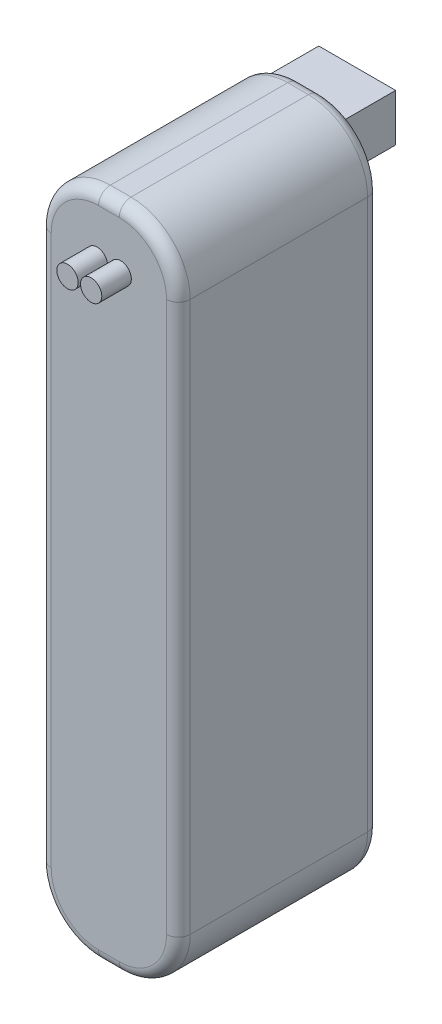
ISO-10303-21;
HEADER;
FILE_DESCRIPTION(('STEP AP214'),'2;1');
FILE_NAME('part.step','',(''),(''),'','','');
FILE_SCHEMA(('AUTOMOTIVE_DESIGN { 1 0 10303 214 1 1 1 1 }'));
ENDSEC;
DATA;
#1=APPLICATION_CONTEXT('core data for automotive mechanical design processes');
#2=APPLICATION_PROTOCOL_DEFINITION('international standard','automotive_design',2000,#1);
#3=PRODUCT_CONTEXT('',#1,'mechanical');
#4=PRODUCT('Part','Part','',(#3));
#5=PRODUCT_RELATED_PRODUCT_CATEGORY('part','',(#4));
#6=PRODUCT_DEFINITION_FORMATION('','',#4);
#7=PRODUCT_DEFINITION_CONTEXT('part definition',#1,'design');
#8=PRODUCT_DEFINITION('design','',#6,#7);
#9=PRODUCT_DEFINITION_SHAPE('','',#8);
#10=(LENGTH_UNIT() NAMED_UNIT(*) SI_UNIT(.MILLI.,.METRE.));
#11=(NAMED_UNIT(*) PLANE_ANGLE_UNIT() SI_UNIT($,.RADIAN.));
#12=(NAMED_UNIT(*) SI_UNIT($,.STERADIAN.) SOLID_ANGLE_UNIT());
#13=UNCERTAINTY_MEASURE_WITH_UNIT(LENGTH_MEASURE(1.E-05),#10,'distance_accuracy_value','');
#14=(GEOMETRIC_REPRESENTATION_CONTEXT(3) GLOBAL_UNCERTAINTY_ASSIGNED_CONTEXT((#13)) GLOBAL_UNIT_ASSIGNED_CONTEXT((#10,
#11,#12)) REPRESENTATION_CONTEXT('',''));
#15=CARTESIAN_POINT('',(0.,0.,0.));
#16=DIRECTION('',(0.,0.,1.));
#17=DIRECTION('',(1.,0.,0.));
#18=AXIS2_PLACEMENT_3D('',#15,#16,#17);
#19=CARTESIAN_POINT('',(-11.75,113.,-17.));
#20=DIRECTION('',(0.,0.,1.));
#21=DIRECTION('',(1.,0.,0.));
#22=AXIS2_PLACEMENT_3D('',#19,#20,#21);
#23=PLANE('',#22);
#24=DIRECTION('',(0.,-1.,0.));
#25=VECTOR('',#24,1.);
#26=CARTESIAN_POINT('',(6.5,103.,-17.));
#27=LINE('',#26,#25);
#28=CARTESIAN_POINT('',(6.5,109.437196594792,-17.));
#29=VERTEX_POINT('',#28);
#30=CARTESIAN_POINT('',(6.5,103.,-17.));
#31=VERTEX_POINT('',#30);
#32=EDGE_CURVE('E442',#29,#31,#27,.T.);
#33=ORIENTED_EDGE('',*,*,#32,.F.);
#34=CARTESIAN_POINT('',(1.75,103.,-17.));
#35=DIRECTION('',(0.,0.,1.));
#36=DIRECTION('',(1.,0.,0.));
#37=AXIS2_PLACEMENT_3D('',#34,#35,#36);
#38=CIRCLE('',#37,8.);
#39=CARTESIAN_POINT('',(9.75,103.,-17.));
#40=VERTEX_POINT('',#39);
#41=EDGE_CURVE('E255',#29,#40,#38,.F.);
#42=ORIENTED_EDGE('',*,*,#41,.T.);
#43=DIRECTION('',(0.,-1.,0.));
#44=VECTOR('',#43,1.);
#45=CARTESIAN_POINT('',(9.75,113.,-17.));
#46=LINE('',#45,#44);
#47=CARTESIAN_POINT('',(9.75,9.99999999999999,-17.));
#48=VERTEX_POINT('',#47);
#49=EDGE_CURVE('E243',#40,#48,#46,.T.);
#50=ORIENTED_EDGE('',*,*,#49,.T.);
#51=CARTESIAN_POINT('',(1.75,9.99999999999999,-17.));
#52=DIRECTION('',(0.,0.,1.));
#53=DIRECTION('',(1.,0.,0.));
#54=AXIS2_PLACEMENT_3D('',#51,#52,#53);
#55=CIRCLE('',#54,8.);
#56=CARTESIAN_POINT('',(1.75,1.99999999999999,-17.));
#57=VERTEX_POINT('',#56);
#58=EDGE_CURVE('E245',#48,#57,#55,.F.);
#59=ORIENTED_EDGE('',*,*,#58,.T.);
#60=DIRECTION('',(-1.,0.,0.));
#61=VECTOR('',#60,1.);
#62=CARTESIAN_POINT('',(-11.75,2.,-17.));
#63=LINE('',#62,#61);
#64=CARTESIAN_POINT('',(-1.75,2.,-17.));
#65=VERTEX_POINT('',#64);
#66=EDGE_CURVE('E247',#57,#65,#63,.T.);
#67=ORIENTED_EDGE('',*,*,#66,.T.);
#68=CARTESIAN_POINT('',(-1.75,9.99999999999999,-17.));
#69=DIRECTION('',(0.,0.,1.));
#70=DIRECTION('',(1.,0.,0.));
#71=AXIS2_PLACEMENT_3D('',#68,#69,#70);
#72=CIRCLE('',#71,8.);
#73=CARTESIAN_POINT('',(-9.75,9.99999999999999,-17.));
#74=VERTEX_POINT('',#73);
#75=EDGE_CURVE('E249',#65,#74,#72,.F.);
#76=ORIENTED_EDGE('',*,*,#75,.T.);
#77=DIRECTION('',(0.,-1.,0.));
#78=VECTOR('',#77,1.);
#79=CARTESIAN_POINT('',(-9.75,113.,-17.));
#80=LINE('',#79,#78);
#81=CARTESIAN_POINT('',(-9.75,103.,-17.));
#82=VERTEX_POINT('',#81);
#83=EDGE_CURVE('E251',#74,#82,#80,.F.);
#84=ORIENTED_EDGE('',*,*,#83,.T.);
#85=CARTESIAN_POINT('',(-1.75,103.,-17.));
#86=DIRECTION('',(0.,0.,1.));
#87=DIRECTION('',(1.,0.,0.));
#88=AXIS2_PLACEMENT_3D('',#85,#86,#87);
#89=CIRCLE('',#88,8.);
#90=CARTESIAN_POINT('',(-6.5,109.437196594792,-17.));
#91=VERTEX_POINT('',#90);
#92=EDGE_CURVE('E253',#82,#91,#89,.F.);
#93=ORIENTED_EDGE('',*,*,#92,.T.);
#94=DIRECTION('',(0.,1.,0.));
#95=VECTOR('',#94,1.);
#96=CARTESIAN_POINT('',(-6.5,103.,-17.));
#97=LINE('',#96,#95);
#98=CARTESIAN_POINT('',(-6.5,103.,-17.));
#99=VERTEX_POINT('',#98);
#100=EDGE_CURVE('E386',#99,#91,#97,.T.);
#101=ORIENTED_EDGE('',*,*,#100,.F.);
#102=DIRECTION('',(-1.,0.,0.));
#103=VECTOR('',#102,1.);
#104=CARTESIAN_POINT('',(6.5,103.,-17.));
#105=LINE('',#104,#103);
#106=EDGE_CURVE('E196',#31,#99,#105,.T.);
#107=ORIENTED_EDGE('',*,*,#106,.F.);
#108=EDGE_LOOP('',(#33,#42,#50,#59,#67,#76,#84,#93,#101,#107));
#109=FACE_BOUND('',#108,.T.);
#110=ADVANCED_FACE('F39',(#109),#23,.F.);
#111=CARTESIAN_POINT('',(11.75,113.,-17.));
#112=DIRECTION('',(-1.,0.,0.));
#113=DIRECTION('',(0.,0.,1.));
#114=AXIS2_PLACEMENT_3D('',#111,#112,#113);
#115=PLANE('',#114);
#116=DIRECTION('',(0.,0.,-1.));
#117=VECTOR('',#116,1.);
#118=CARTESIAN_POINT('',(11.75,9.99999999999999,-17.));
#119=LINE('',#118,#117);
#120=CARTESIAN_POINT('',(11.75,9.99999999999999,15.));
#121=VERTEX_POINT('',#120);
#122=CARTESIAN_POINT('',(11.75,9.99999999999999,-15.));
#123=VERTEX_POINT('',#122);
#124=EDGE_CURVE('E222',#121,#123,#119,.T.);
#125=ORIENTED_EDGE('',*,*,#124,.T.);
#126=DIRECTION('',(0.,-1.,0.));
#127=VECTOR('',#126,1.);
#128=CARTESIAN_POINT('',(11.75,113.,-15.));
#129=LINE('',#128,#127);
#130=CARTESIAN_POINT('',(11.75,103.,-15.));
#131=VERTEX_POINT('',#130);
#132=EDGE_CURVE('E306',#123,#131,#129,.F.);
#133=ORIENTED_EDGE('',*,*,#132,.T.);
#134=DIRECTION('',(0.,0.,-1.));
#135=VECTOR('',#134,1.);
#136=CARTESIAN_POINT('',(11.75,103.,17.));
#137=LINE('',#136,#135);
#138=CARTESIAN_POINT('',(11.75,103.,15.));
#139=VERTEX_POINT('',#138);
#140=EDGE_CURVE('E219',#131,#139,#137,.F.);
#141=ORIENTED_EDGE('',*,*,#140,.T.);
#142=DIRECTION('',(0.,-1.,0.));
#143=VECTOR('',#142,1.);
#144=CARTESIAN_POINT('',(11.75,113.,15.));
#145=LINE('',#144,#143);
#146=EDGE_CURVE('E304',#139,#121,#145,.T.);
#147=ORIENTED_EDGE('',*,*,#146,.T.);
#148=EDGE_LOOP('',(#125,#133,#141,#147));
#149=FACE_BOUND('',#148,.T.);
#150=ADVANCED_FACE('F512',(#149),#115,.F.);
#151=CARTESIAN_POINT('',(-11.75,113.,-17.));
#152=DIRECTION('',(1.,0.,0.));
#153=DIRECTION('',(0.,0.,-1.));
#154=AXIS2_PLACEMENT_3D('',#151,#152,#153);
#155=PLANE('',#154);
#156=DIRECTION('',(0.,0.,1.));
#157=VECTOR('',#156,1.);
#158=CARTESIAN_POINT('',(-11.75,103.,-17.));
#159=LINE('',#158,#157);
#160=CARTESIAN_POINT('',(-11.75,103.,15.));
#161=VERTEX_POINT('',#160);
#162=CARTESIAN_POINT('',(-11.75,103.,-15.));
#163=VERTEX_POINT('',#162);
#164=EDGE_CURVE('E231',#161,#163,#159,.F.);
#165=ORIENTED_EDGE('',*,*,#164,.T.);
#166=DIRECTION('',(0.,-1.,0.));
#167=VECTOR('',#166,1.);
#168=CARTESIAN_POINT('',(-11.75,113.,-15.));
#169=LINE('',#168,#167);
#170=CARTESIAN_POINT('',(-11.75,9.99999999999999,-15.));
#171=VERTEX_POINT('',#170);
#172=EDGE_CURVE('E273',#163,#171,#169,.T.);
#173=ORIENTED_EDGE('',*,*,#172,.T.);
#174=DIRECTION('',(0.,0.,1.));
#175=VECTOR('',#174,1.);
#176=CARTESIAN_POINT('',(-11.75,9.99999999999999,-17.));
#177=LINE('',#176,#175);
#178=CARTESIAN_POINT('',(-11.75,9.99999999999999,15.));
#179=VERTEX_POINT('',#178);
#180=EDGE_CURVE('E234',#171,#179,#177,.T.);
#181=ORIENTED_EDGE('',*,*,#180,.T.);
#182=DIRECTION('',(0.,-1.,0.));
#183=VECTOR('',#182,1.);
#184=CARTESIAN_POINT('',(-11.75,113.,15.));
#185=LINE('',#184,#183);
#186=EDGE_CURVE('E271',#179,#161,#185,.F.);
#187=ORIENTED_EDGE('',*,*,#186,.T.);
#188=EDGE_LOOP('',(#165,#173,#181,#187));
#189=FACE_BOUND('',#188,.T.);
#190=ADVANCED_FACE('F424',(#189),#155,.F.);
#191=CARTESIAN_POINT('',(-11.75,113.,17.));
#192=DIRECTION('',(0.,0.,-1.));
#193=DIRECTION('',(-1.,0.,0.));
#194=AXIS2_PLACEMENT_3D('',#191,#192,#193);
#195=PLANE('',#194);
#196=DIRECTION('',(0.,-1.,0.));
#197=VECTOR('',#196,1.);
#198=CARTESIAN_POINT('',(9.75,113.,17.));
#199=LINE('',#198,#197);
#200=CARTESIAN_POINT('',(9.75,9.99999999999999,17.));
#201=VERTEX_POINT('',#200);
#202=CARTESIAN_POINT('',(9.75,103.,17.));
#203=VERTEX_POINT('',#202);
#204=EDGE_CURVE('E287',#201,#203,#199,.F.);
#205=ORIENTED_EDGE('',*,*,#204,.T.);
#206=CARTESIAN_POINT('',(1.75,103.,17.));
#207=DIRECTION('',(0.,0.,-1.));
#208=DIRECTION('',(-1.,0.,0.));
#209=AXIS2_PLACEMENT_3D('',#206,#207,#208);
#210=CIRCLE('',#209,8.);
#211=CARTESIAN_POINT('',(1.75,111.,17.));
#212=VERTEX_POINT('',#211);
#213=EDGE_CURVE('E301',#203,#212,#210,.F.);
#214=ORIENTED_EDGE('',*,*,#213,.T.);
#215=DIRECTION('',(1.,0.,0.));
#216=VECTOR('',#215,1.);
#217=CARTESIAN_POINT('',(-1.75,111.,17.));
#218=LINE('',#217,#216);
#219=CARTESIAN_POINT('',(-1.75,111.,17.));
#220=VERTEX_POINT('',#219);
#221=EDGE_CURVE('E299',#212,#220,#218,.F.);
#222=ORIENTED_EDGE('',*,*,#221,.T.);
#223=CARTESIAN_POINT('',(-1.75,103.,17.));
#224=DIRECTION('',(0.,0.,-1.));
#225=DIRECTION('',(-1.,0.,0.));
#226=AXIS2_PLACEMENT_3D('',#223,#224,#225);
#227=CIRCLE('',#226,8.);
#228=CARTESIAN_POINT('',(-9.75,103.,17.));
#229=VERTEX_POINT('',#228);
#230=EDGE_CURVE('E297',#220,#229,#227,.F.);
#231=ORIENTED_EDGE('',*,*,#230,.T.);
#232=DIRECTION('',(0.,-1.,0.));
#233=VECTOR('',#232,1.);
#234=CARTESIAN_POINT('',(-9.75,113.,17.));
#235=LINE('',#234,#233);
#236=CARTESIAN_POINT('',(-9.75,9.99999999999999,17.));
#237=VERTEX_POINT('',#236);
#238=EDGE_CURVE('E295',#229,#237,#235,.T.);
#239=ORIENTED_EDGE('',*,*,#238,.T.);
#240=CARTESIAN_POINT('',(-1.75,9.99999999999999,17.));
#241=DIRECTION('',(0.,0.,-1.));
#242=DIRECTION('',(-1.,0.,0.));
#243=AXIS2_PLACEMENT_3D('',#240,#241,#242);
#244=CIRCLE('',#243,8.);
#245=CARTESIAN_POINT('',(-1.75,2.,17.));
#246=VERTEX_POINT('',#245);
#247=EDGE_CURVE('E293',#237,#246,#244,.F.);
#248=ORIENTED_EDGE('',*,*,#247,.T.);
#249=DIRECTION('',(1.,0.,0.));
#250=VECTOR('',#249,1.);
#251=CARTESIAN_POINT('',(-11.75,2.,17.));
#252=LINE('',#251,#250);
#253=CARTESIAN_POINT('',(1.75,1.99999999999999,17.));
#254=VERTEX_POINT('',#253);
#255=EDGE_CURVE('E291',#246,#254,#252,.T.);
#256=ORIENTED_EDGE('',*,*,#255,.T.);
#257=CARTESIAN_POINT('',(1.75,9.99999999999999,17.));
#258=DIRECTION('',(0.,0.,-1.));
#259=DIRECTION('',(-1.,0.,0.));
#260=AXIS2_PLACEMENT_3D('',#257,#258,#259);
#261=CIRCLE('',#260,8.);
#262=EDGE_CURVE('E289',#254,#201,#261,.F.);
#263=ORIENTED_EDGE('',*,*,#262,.T.);
#264=EDGE_LOOP('',(#205,#214,#222,#231,#239,#248,#256,#263));
#265=FACE_BOUND('',#264,.T.);
#266=CARTESIAN_POINT('',(2.,103.,17.));
#267=DIRECTION('',(0.,0.,-1.));
#268=DIRECTION('',(-1.,0.,0.));
#269=AXIS2_PLACEMENT_3D('',#266,#267,#268);
#270=CIRCLE('',#269,1.8);
#271=CARTESIAN_POINT('',(0.200000000000004,103.,17.));
#272=VERTEX_POINT('',#271);
#273=EDGE_CURVE('E216',#272,#272,#270,.F.);
#274=ORIENTED_EDGE('',*,*,#273,.F.);
#275=EDGE_LOOP('',(#274));
#276=FACE_BOUND('',#275,.T.);
#277=CARTESIAN_POINT('',(-2.,103.,17.));
#278=DIRECTION('',(0.,0.,-1.));
#279=DIRECTION('',(-1.,0.,0.));
#280=AXIS2_PLACEMENT_3D('',#277,#278,#279);
#281=CIRCLE('',#280,1.8);
#282=CARTESIAN_POINT('',(-3.8,103.,17.));
#283=VERTEX_POINT('',#282);
#284=EDGE_CURVE('E213',#283,#283,#281,.F.);
#285=ORIENTED_EDGE('',*,*,#284,.F.);
#286=EDGE_LOOP('',(#285));
#287=FACE_BOUND('',#286,.T.);
#288=ADVANCED_FACE('F489',(#265,#276,#287),#195,.F.);
#289=CARTESIAN_POINT('',(0.,113.,0.));
#290=DIRECTION('',(0.,1.,0.));
#291=DIRECTION('',(0.,0.,1.));
#292=AXIS2_PLACEMENT_3D('',#289,#290,#291);
#293=PLANE('',#292);
#294=DIRECTION('',(0.,0.,-1.));
#295=VECTOR('',#294,1.);
#296=CARTESIAN_POINT('',(1.75,113.,-17.));
#297=LINE('',#296,#295);
#298=CARTESIAN_POINT('',(1.75,113.,15.));
#299=VERTEX_POINT('',#298);
#300=CARTESIAN_POINT('',(1.75,113.,-15.));
#301=VERTEX_POINT('',#300);
#302=EDGE_CURVE('E237',#299,#301,#297,.T.);
#303=ORIENTED_EDGE('',*,*,#302,.T.);
#304=DIRECTION('',(-1.,0.,0.));
#305=VECTOR('',#304,1.);
#306=CARTESIAN_POINT('',(-1.75,113.,-15.));
#307=LINE('',#306,#305);
#308=CARTESIAN_POINT('',(-1.75,113.,-15.));
#309=VERTEX_POINT('',#308);
#310=EDGE_CURVE('E265',#301,#309,#307,.T.);
#311=ORIENTED_EDGE('',*,*,#310,.T.);
#312=DIRECTION('',(0.,0.,1.));
#313=VECTOR('',#312,1.);
#314=CARTESIAN_POINT('',(-1.75,113.,17.));
#315=LINE('',#314,#313);
#316=CARTESIAN_POINT('',(-1.75,113.,15.));
#317=VERTEX_POINT('',#316);
#318=EDGE_CURVE('E240',#309,#317,#315,.T.);
#319=ORIENTED_EDGE('',*,*,#318,.T.);
#320=DIRECTION('',(1.,0.,0.));
#321=VECTOR('',#320,1.);
#322=CARTESIAN_POINT('',(1.75,113.,15.));
#323=LINE('',#322,#321);
#324=EDGE_CURVE('E263',#317,#299,#323,.T.);
#325=ORIENTED_EDGE('',*,*,#324,.T.);
#326=EDGE_LOOP('',(#303,#311,#319,#325));
#327=FACE_BOUND('',#326,.T.);
#328=ADVANCED_FACE('F503',(#327),#293,.T.);
#329=CARTESIAN_POINT('',(0.,0.,0.));
#330=DIRECTION('',(0.,1.,0.));
#331=DIRECTION('',(0.,0.,1.));
#332=AXIS2_PLACEMENT_3D('',#329,#330,#331);
#333=PLANE('',#332);
#334=DIRECTION('',(0.,0.,1.));
#335=VECTOR('',#334,1.);
#336=CARTESIAN_POINT('',(-1.75,0.,0.));
#337=LINE('',#336,#335);
#338=CARTESIAN_POINT('',(-1.75,0.,15.));
#339=VERTEX_POINT('',#338);
#340=CARTESIAN_POINT('',(-1.75,0.,-15.));
#341=VERTEX_POINT('',#340);
#342=EDGE_CURVE('E225',#339,#341,#337,.F.);
#343=ORIENTED_EDGE('',*,*,#342,.T.);
#344=DIRECTION('',(-1.,0.,0.));
#345=VECTOR('',#344,1.);
#346=CARTESIAN_POINT('',(0.,0.,-15.));
#347=LINE('',#346,#345);
#348=CARTESIAN_POINT('',(1.75,0.,-15.));
#349=VERTEX_POINT('',#348);
#350=EDGE_CURVE('E281',#341,#349,#347,.F.);
#351=ORIENTED_EDGE('',*,*,#350,.T.);
#352=DIRECTION('',(0.,0.,-1.));
#353=VECTOR('',#352,1.);
#354=CARTESIAN_POINT('',(1.75,0.,0.));
#355=LINE('',#354,#353);
#356=CARTESIAN_POINT('',(1.75,0.,15.));
#357=VERTEX_POINT('',#356);
#358=EDGE_CURVE('E228',#349,#357,#355,.F.);
#359=ORIENTED_EDGE('',*,*,#358,.T.);
#360=DIRECTION('',(1.,0.,0.));
#361=VECTOR('',#360,1.);
#362=CARTESIAN_POINT('',(0.,0.,15.));
#363=LINE('',#362,#361);
#364=EDGE_CURVE('E279',#357,#339,#363,.F.);
#365=ORIENTED_EDGE('',*,*,#364,.T.);
#366=EDGE_LOOP('',(#343,#351,#359,#365));
#367=FACE_BOUND('',#366,.T.);
#368=ADVANCED_FACE('F472',(#367),#333,.F.);
#369=CARTESIAN_POINT('',(-2.,103.,22.));
#370=DIRECTION('',(0.,0.,-1.));
#371=DIRECTION('',(-1.,0.,0.));
#372=AXIS2_PLACEMENT_3D('',#369,#370,#371);
#373=CYLINDRICAL_SURFACE('',#372,1.8);
#374=CARTESIAN_POINT('',(-2.,103.,22.));
#375=DIRECTION('',(0.,0.,1.));
#376=DIRECTION('',(1.,0.,0.));
#377=AXIS2_PLACEMENT_3D('',#374,#375,#376);
#378=CIRCLE('',#377,1.8);
#379=CARTESIAN_POINT('',(-0.200000000000004,103.,22.));
#380=VERTEX_POINT('',#379);
#381=EDGE_CURVE('E205',#380,#380,#378,.T.);
#382=ORIENTED_EDGE('',*,*,#381,.F.);
#383=EDGE_LOOP('',(#382));
#384=FACE_BOUND('',#383,.T.);
#385=ORIENTED_EDGE('',*,*,#284,.T.);
#386=EDGE_LOOP('',(#385));
#387=FACE_BOUND('',#386,.T.);
#388=ADVANCED_FACE('F650',(#384,#387),#373,.T.);
#389=CARTESIAN_POINT('',(-2.,103.,22.));
#390=DIRECTION('',(0.,0.,1.));
#391=DIRECTION('',(1.,0.,0.));
#392=AXIS2_PLACEMENT_3D('',#389,#390,#391);
#393=PLANE('',#392);
#394=ORIENTED_EDGE('',*,*,#381,.T.);
#395=EDGE_LOOP('',(#394));
#396=FACE_BOUND('',#395,.T.);
#397=ADVANCED_FACE('F719',(#396),#393,.T.);
#398=CARTESIAN_POINT('',(2.,103.,22.));
#399=DIRECTION('',(0.,0.,-1.));
#400=DIRECTION('',(-1.,0.,0.));
#401=AXIS2_PLACEMENT_3D('',#398,#399,#400);
#402=CYLINDRICAL_SURFACE('',#401,1.8);
#403=CARTESIAN_POINT('',(2.,103.,22.));
#404=DIRECTION('',(0.,0.,1.));
#405=DIRECTION('',(-1.,0.,0.));
#406=AXIS2_PLACEMENT_3D('',#403,#404,#405);
#407=CIRCLE('',#406,1.8);
#408=CARTESIAN_POINT('',(0.200000000000004,103.,22.));
#409=VERTEX_POINT('',#408);
#410=EDGE_CURVE('E202',#409,#409,#407,.T.);
#411=ORIENTED_EDGE('',*,*,#410,.F.);
#412=EDGE_LOOP('',(#411));
#413=FACE_BOUND('',#412,.T.);
#414=ORIENTED_EDGE('',*,*,#273,.T.);
#415=EDGE_LOOP('',(#414));
#416=FACE_BOUND('',#415,.T.);
#417=ADVANCED_FACE('F708',(#413,#416),#402,.T.);
#418=CARTESIAN_POINT('',(2.,103.,22.));
#419=DIRECTION('',(0.,0.,-1.));
#420=DIRECTION('',(-1.,0.,0.));
#421=AXIS2_PLACEMENT_3D('',#418,#419,#420);
#422=PLANE('',#421);
#423=ORIENTED_EDGE('',*,*,#410,.T.);
#424=EDGE_LOOP('',(#423));
#425=FACE_BOUND('',#424,.T.);
#426=ADVANCED_FACE('F641',(#425),#422,.F.);
#427=CARTESIAN_POINT('',(-6.5,103.,-25.));
#428=DIRECTION('',(1.,0.,0.));
#429=DIRECTION('',(0.,1.,0.));
#430=AXIS2_PLACEMENT_3D('',#427,#428,#429);
#431=PLANE('',#430);
#432=ORIENTED_EDGE('',*,*,#100,.T.);
#433=CARTESIAN_POINT('',(-6.5,111.,-16.5165264677635));
#434=CARTESIAN_POINT('',(-6.5,110.944165872478,-16.5578044131544));
#435=CARTESIAN_POINT('',(-6.5,110.886427336748,-16.596411822724));
#436=CARTESIAN_POINT('',(-6.5,110.767759053518,-16.6682339497463));
#437=CARTESIAN_POINT('',(-6.5,110.706832406264,-16.701453781976));
#438=CARTESIAN_POINT('',(-6.5,110.521111365666,-16.7925342911873));
#439=CARTESIAN_POINT('',(-6.5,110.392386240248,-16.8425325902002));
#440=CARTESIAN_POINT('',(-6.5,110.12937001621,-16.9216428874628));
#441=CARTESIAN_POINT('',(-6.5,109.995101232131,-16.9508313489459));
#442=CARTESIAN_POINT('',(-6.5,109.723318778962,-16.9897879758277));
#443=CARTESIAN_POINT('',(-6.5,109.585794765912,-16.9994823437944));
#444=CARTESIAN_POINT('',(-6.5,109.288073807776,-17.0005599983109));
#445=CARTESIAN_POINT('',(-6.5,109.1278712464,-16.9886662604527));
#446=CARTESIAN_POINT('',(-6.5,108.811771304163,-16.9419016465961));
#447=CARTESIAN_POINT('',(-6.5,108.65585439613,-16.9071639318925));
#448=CARTESIAN_POINT('',(-6.5,108.503299069863,-16.8619044782554));
#449=B_SPLINE_CURVE_WITH_KNOTS('',3,(#433,#434,#435,#436,#437,#438,#439,#440,#441,#442,#443,
#444,#445,#446,#447,#448),.UNSPECIFIED.,.F.,.F.,(4,2,2,2,2,2,2,4),(0.,0.20813301069564,
0.41606725565704,0.828320924701577,1.23905189954815,1.65133484476064,2.13148664441693,
2.60886407888918),.UNSPECIFIED.);
#450=CARTESIAN_POINT('',(-6.5,111.,-16.5165264677635));
#451=VERTEX_POINT('',#450);
#452=EDGE_CURVE('E48',#91,#451,#449,.F.);
#453=ORIENTED_EDGE('',*,*,#452,.T.);
#454=DIRECTION('',(0.,0.,1.));
#455=VECTOR('',#454,1.);
#456=CARTESIAN_POINT('',(-6.5,111.,-25.));
#457=LINE('',#456,#455);
#458=CARTESIAN_POINT('',(-6.5,111.,-25.));
#459=VERTEX_POINT('',#458);
#460=EDGE_CURVE('E55',#459,#451,#457,.T.);
#461=ORIENTED_EDGE('',*,*,#460,.F.);
#462=DIRECTION('',(0.,1.,0.));
#463=VECTOR('',#462,1.);
#464=CARTESIAN_POINT('',(-6.5,103.,-25.));
#465=LINE('',#464,#463);
#466=CARTESIAN_POINT('',(-6.5,103.,-25.));
#467=VERTEX_POINT('',#466);
#468=EDGE_CURVE('E187',#467,#459,#465,.T.);
#469=ORIENTED_EDGE('',*,*,#468,.F.);
#470=DIRECTION('',(0.,0.,1.));
#471=VECTOR('',#470,1.);
#472=CARTESIAN_POINT('',(-6.5,103.,-25.));
#473=LINE('',#472,#471);
#474=EDGE_CURVE('E439',#467,#99,#473,.T.);
#475=ORIENTED_EDGE('',*,*,#474,.T.);
#476=EDGE_LOOP('',(#432,#453,#461,#469,#475));
#477=FACE_BOUND('',#476,.T.);
#478=ADVANCED_FACE('F199',(#477),#431,.F.);
#479=CARTESIAN_POINT('',(6.5,111.,-25.));
#480=DIRECTION('',(0.,-1.,0.));
#481=DIRECTION('',(0.,0.,-1.));
#482=AXIS2_PLACEMENT_3D('',#479,#480,#481);
#483=PLANE('',#482);
#484=ORIENTED_EDGE('',*,*,#460,.T.);
#485=CARTESIAN_POINT('',(-1.75,111.,-17.));
#486=CARTESIAN_POINT('',(-1.83453775956762,111.,-16.9999957123445));
#487=CARTESIAN_POINT('',(-1.91907550013527,111.,-17.0000005401787));
#488=CARTESIAN_POINT('',(-2.08815034058604,111.,-16.999991383787));
#489=CARTESIAN_POINT('',(-2.17268744046917,111.,-16.9999773997032));
#490=CARTESIAN_POINT('',(-2.42633297639141,111.,-16.9998516494349));
#491=CARTESIAN_POINT('',(-2.59544146227854,111.,-16.9996560570032));
#492=CARTESIAN_POINT('',(-2.9355944308341,111.,-16.9982827732277));
#493=CARTESIAN_POINT('',(-3.10663888826025,111.,-16.9970938514694));
#494=CARTESIAN_POINT('',(-3.44868794541231,111.,-16.9924445771897));
#495=CARTESIAN_POINT('',(-3.6196925473715,111.,-16.9889844376104));
#496=CARTESIAN_POINT('',(-3.9555646020987,111.,-16.9782626570917));
#497=CARTESIAN_POINT('',(-4.12043601312986,111.,-16.9711392448913));
#498=CARTESIAN_POINT('',(-4.44983157312859,111.,-16.9512468164156));
#499=CARTESIAN_POINT('',(-4.61435578532143,111.,-16.938478936935));
#500=CARTESIAN_POINT('',(-4.94187720032507,111.,-16.9050488195379));
#501=CARTESIAN_POINT('',(-5.10487794469456,111.,-16.8844226957226));
#502=CARTESIAN_POINT('',(-5.42914414543841,111.,-16.8325345462489));
#503=CARTESIAN_POINT('',(-5.59041093257882,111.,-16.8012813827687));
#504=CARTESIAN_POINT('',(-5.82640722447257,111.,-16.7447479820912));
#505=CARTESIAN_POINT('',(-5.90242987311748,111.,-16.7248452304421));
#506=CARTESIAN_POINT('',(-6.05344966089942,111.,-16.6814040663049));
#507=CARTESIAN_POINT('',(-6.12844666170127,111.,-16.6578651685513));
#508=CARTESIAN_POINT('',(-6.27759118190454,111.,-16.6065107591883));
#509=CARTESIAN_POINT('',(-6.35172853164822,111.,-16.5786653396536));
#510=CARTESIAN_POINT('',(-6.49812992900573,111.,-16.5182764741276));
#511=CARTESIAN_POINT('',(-6.57039233852412,111.,-16.485729073022));
#512=CARTESIAN_POINT('',(-6.64142280556408,111.,-16.4505795822207));
#513=B_SPLINE_CURVE_WITH_KNOTS('',3,(#485,#486,#487,#488,#489,#490,#491,#492,#493,#494,#495,
#496,#497,#498,#499,#500,#501,#502,#503,#504,#505,#506,#507,#508,#509,#510,#511,#512),
.UNSPECIFIED.,.F.,.F.,(4,2,2,2,2,2,2,2,2,2,2,2,2,4),(0.,0.253613239538808,0.5072245642014,
1.01454977287167,1.52768957622267,2.04078127606057,2.53579583145607,3.03071073638809,
3.52337807597046,4.01563557035226,4.25131605573454,4.48702802130833,4.72445727028078,
4.96208741059454),.UNSPECIFIED.);
#514=CARTESIAN_POINT('',(-1.75,111.,-17.));
#515=VERTEX_POINT('',#514);
#516=EDGE_CURVE('E11',#451,#515,#513,.F.);
#517=ORIENTED_EDGE('',*,*,#516,.T.);
#518=DIRECTION('',(1.,0.,0.));
#519=VECTOR('',#518,1.);
#520=CARTESIAN_POINT('',(6.5,111.,-17.));
#521=LINE('',#520,#519);
#522=CARTESIAN_POINT('',(1.75,111.,-17.));
#523=VERTEX_POINT('',#522);
#524=EDGE_CURVE('E440',#515,#523,#521,.T.);
#525=ORIENTED_EDGE('',*,*,#524,.T.);
#526=CARTESIAN_POINT('',(1.75,111.,-17.));
#527=CARTESIAN_POINT('',(1.83453775956761,111.,-16.9999957123445));
#528=CARTESIAN_POINT('',(1.91907550013527,111.,-17.0000005401787));
#529=CARTESIAN_POINT('',(2.08815034058603,111.,-16.999991383787));
#530=CARTESIAN_POINT('',(2.17268744046916,111.,-16.9999773997032));
#531=CARTESIAN_POINT('',(2.42633297639141,111.,-16.9998516494349));
#532=CARTESIAN_POINT('',(2.59544146227853,111.,-16.9996560570032));
#533=CARTESIAN_POINT('',(2.93559443083409,111.,-16.9982827732277));
#534=CARTESIAN_POINT('',(3.10663888826025,111.,-16.9970938514694));
#535=CARTESIAN_POINT('',(3.44868794541231,111.,-16.9924445771897));
#536=CARTESIAN_POINT('',(3.61969254737149,111.,-16.9889844376104));
#537=CARTESIAN_POINT('',(3.95556460209869,111.,-16.9782626570917));
#538=CARTESIAN_POINT('',(4.12043601312986,111.,-16.9711392448913));
#539=CARTESIAN_POINT('',(4.44983157312858,111.,-16.9512468164156));
#540=CARTESIAN_POINT('',(4.61435578532142,111.,-16.938478936935));
#541=CARTESIAN_POINT('',(4.94187720032506,111.,-16.9050488195379));
#542=CARTESIAN_POINT('',(5.10487794469455,111.,-16.8844226957226));
#543=CARTESIAN_POINT('',(5.42914414543841,111.,-16.8325345462489));
#544=CARTESIAN_POINT('',(5.59041093257881,111.,-16.8012813827687));
#545=CARTESIAN_POINT('',(5.82640722447256,111.,-16.7447479820912));
#546=CARTESIAN_POINT('',(5.90242987311748,111.,-16.7248452304421));
#547=CARTESIAN_POINT('',(6.05344966089941,111.,-16.6814040663049));
#548=CARTESIAN_POINT('',(6.12844666170126,111.,-16.6578651685513));
#549=CARTESIAN_POINT('',(6.27759118190453,111.,-16.6065107591883));
#550=CARTESIAN_POINT('',(6.35172853164822,111.,-16.5786653396536));
#551=CARTESIAN_POINT('',(6.49812992900572,111.,-16.5182764741276));
#552=CARTESIAN_POINT('',(6.57039233852412,111.,-16.485729073022));
#553=CARTESIAN_POINT('',(6.64142280556408,111.,-16.4505795822207));
#554=B_SPLINE_CURVE_WITH_KNOTS('',3,(#526,#527,#528,#529,#530,#531,#532,#533,#534,#535,#536,
#537,#538,#539,#540,#541,#542,#543,#544,#545,#546,#547,#548,#549,#550,#551,#552,#553),
.UNSPECIFIED.,.F.,.F.,(4,2,2,2,2,2,2,2,2,2,2,2,2,4),(0.,0.253613239538808,0.5072245642014,
1.01454977287167,1.52768957622267,2.04078127606057,2.53579583145607,3.03071073638809,
3.52337807597046,4.01563557035226,4.25131605573454,4.48702802130833,4.72445727028078,
4.96208741059455),.UNSPECIFIED.);
#555=CARTESIAN_POINT('',(6.5,111.,-16.516526467764));
#556=VERTEX_POINT('',#555);
#557=EDGE_CURVE('E308',#523,#556,#554,.T.);
#558=ORIENTED_EDGE('',*,*,#557,.T.);
#559=DIRECTION('',(0.,0.,1.));
#560=VECTOR('',#559,1.);
#561=CARTESIAN_POINT('',(6.5,111.,-25.));
#562=LINE('',#561,#560);
#563=CARTESIAN_POINT('',(6.5,111.,-25.));
#564=VERTEX_POINT('',#563);
#565=EDGE_CURVE('E63',#564,#556,#562,.T.);
#566=ORIENTED_EDGE('',*,*,#565,.F.);
#567=DIRECTION('',(1.,0.,0.));
#568=VECTOR('',#567,1.);
#569=CARTESIAN_POINT('',(6.5,111.,-25.));
#570=LINE('',#569,#568);
#571=EDGE_CURVE('E181',#459,#564,#570,.T.);
#572=ORIENTED_EDGE('',*,*,#571,.F.);
#573=EDGE_LOOP('',(#484,#517,#525,#558,#566,#572));
#574=FACE_BOUND('',#573,.T.);
#575=ADVANCED_FACE('F183',(#574),#483,.F.);
#576=CARTESIAN_POINT('',(6.5,103.,-25.));
#577=DIRECTION('',(-1.,0.,0.));
#578=DIRECTION('',(0.,0.,1.));
#579=AXIS2_PLACEMENT_3D('',#576,#577,#578);
#580=PLANE('',#579);
#581=ORIENTED_EDGE('',*,*,#565,.T.);
#582=CARTESIAN_POINT('',(6.5,111.,-16.5165264677635));
#583=CARTESIAN_POINT('',(6.5,110.944165872478,-16.5578044131544));
#584=CARTESIAN_POINT('',(6.5,110.886427336748,-16.596411822724));
#585=CARTESIAN_POINT('',(6.5,110.767759053518,-16.6682339497463));
#586=CARTESIAN_POINT('',(6.5,110.706832406264,-16.701453781976));
#587=CARTESIAN_POINT('',(6.5,110.521111365666,-16.7925342911873));
#588=CARTESIAN_POINT('',(6.5,110.392386240248,-16.8425325902002));
#589=CARTESIAN_POINT('',(6.5,110.12937001621,-16.9216428874628));
#590=CARTESIAN_POINT('',(6.5,109.995101232131,-16.9508313489459));
#591=CARTESIAN_POINT('',(6.5,109.723318778962,-16.9897879758277));
#592=CARTESIAN_POINT('',(6.5,109.585794765912,-16.9994823437944));
#593=CARTESIAN_POINT('',(6.5,109.288073807776,-17.0005599983109));
#594=CARTESIAN_POINT('',(6.5,109.1278712464,-16.9886662604527));
#595=CARTESIAN_POINT('',(6.5,108.811771304163,-16.9419016465961));
#596=CARTESIAN_POINT('',(6.5,108.65585439613,-16.9071639318925));
#597=CARTESIAN_POINT('',(6.5,108.503299069863,-16.8619044782554));
#598=B_SPLINE_CURVE_WITH_KNOTS('',3,(#582,#583,#584,#585,#586,#587,#588,#589,#590,#591,#592,
#593,#594,#595,#596,#597),.UNSPECIFIED.,.F.,.F.,(4,2,2,2,2,2,2,4),(0.,0.20813301069564,
0.41606725565703,0.82832092470158,1.23905189954815,1.65133484476066,2.13148664441696,
2.60886407888919),.UNSPECIFIED.);
#599=EDGE_CURVE('E316',#556,#29,#598,.T.);
#600=ORIENTED_EDGE('',*,*,#599,.T.);
#601=ORIENTED_EDGE('',*,*,#32,.T.);
#602=DIRECTION('',(0.,0.,1.));
#603=VECTOR('',#602,1.);
#604=CARTESIAN_POINT('',(6.5,103.,-25.));
#605=LINE('',#604,#603);
#606=CARTESIAN_POINT('',(6.5,103.,-25.));
#607=VERTEX_POINT('',#606);
#608=EDGE_CURVE('E207',#607,#31,#605,.T.);
#609=ORIENTED_EDGE('',*,*,#608,.F.);
#610=DIRECTION('',(0.,-1.,0.));
#611=VECTOR('',#610,1.);
#612=CARTESIAN_POINT('',(6.5,103.,-25.));
#613=LINE('',#612,#611);
#614=EDGE_CURVE('E186',#564,#607,#613,.T.);
#615=ORIENTED_EDGE('',*,*,#614,.F.);
#616=EDGE_LOOP('',(#581,#600,#601,#609,#615));
#617=FACE_BOUND('',#616,.T.);
#618=ADVANCED_FACE('F453',(#617),#580,.F.);
#619=CARTESIAN_POINT('',(6.5,103.,-25.));
#620=DIRECTION('',(0.,1.,0.));
#621=DIRECTION('',(0.,0.,1.));
#622=AXIS2_PLACEMENT_3D('',#619,#620,#621);
#623=PLANE('',#622);
#624=ORIENTED_EDGE('',*,*,#106,.T.);
#625=ORIENTED_EDGE('',*,*,#474,.F.);
#626=DIRECTION('',(-1.,0.,0.));
#627=VECTOR('',#626,1.);
#628=CARTESIAN_POINT('',(6.5,103.,-25.));
#629=LINE('',#628,#627);
#630=EDGE_CURVE('E192',#607,#467,#629,.T.);
#631=ORIENTED_EDGE('',*,*,#630,.F.);
#632=ORIENTED_EDGE('',*,*,#608,.T.);
#633=EDGE_LOOP('',(#624,#625,#631,#632));
#634=FACE_BOUND('',#633,.T.);
#635=ADVANCED_FACE('F452',(#634),#623,.F.);
#636=CARTESIAN_POINT('',(0.,0.,-25.));
#637=DIRECTION('',(0.,0.,1.));
#638=DIRECTION('',(1.,0.,0.));
#639=AXIS2_PLACEMENT_3D('',#636,#637,#638);
#640=PLANE('',#639);
#641=ORIENTED_EDGE('',*,*,#468,.T.);
#642=ORIENTED_EDGE('',*,*,#571,.T.);
#643=ORIENTED_EDGE('',*,*,#614,.T.);
#644=ORIENTED_EDGE('',*,*,#630,.T.);
#645=EDGE_LOOP('',(#641,#642,#643,#644));
#646=FACE_BOUND('',#645,.T.);
#647=ADVANCED_FACE('F190',(#646),#640,.F.);
#648=CARTESIAN_POINT('',(1.75,9.99999999999999,-17.));
#649=DIRECTION('',(0.,0.,-1.));
#650=DIRECTION('',(-1.,0.,0.));
#651=AXIS2_PLACEMENT_3D('',#648,#649,#650);
#652=CYLINDRICAL_SURFACE('',#651,10.);
#653=ORIENTED_EDGE('',*,*,#358,.F.);
#654=CARTESIAN_POINT('',(1.75,9.99999999999999,-15.));
#655=DIRECTION('',(0.,0.,1.));
#656=DIRECTION('',(1.,0.,0.));
#657=AXIS2_PLACEMENT_3D('',#654,#655,#656);
#658=CIRCLE('',#657,10.);
#659=EDGE_CURVE('E285',#349,#123,#658,.T.);
#660=ORIENTED_EDGE('',*,*,#659,.T.);
#661=ORIENTED_EDGE('',*,*,#124,.F.);
#662=CARTESIAN_POINT('',(1.75,9.99999999999999,15.));
#663=DIRECTION('',(0.,0.,-1.));
#664=DIRECTION('',(-1.,0.,0.));
#665=AXIS2_PLACEMENT_3D('',#662,#663,#664);
#666=CIRCLE('',#665,10.);
#667=EDGE_CURVE('E283',#121,#357,#666,.T.);
#668=ORIENTED_EDGE('',*,*,#667,.T.);
#669=EDGE_LOOP('',(#653,#660,#661,#668));
#670=FACE_BOUND('',#669,.T.);
#671=ADVANCED_FACE('F475',(#670),#652,.T.);
#672=CARTESIAN_POINT('',(-1.75,9.99999999999999,-17.));
#673=DIRECTION('',(0.,0.,1.));
#674=DIRECTION('',(1.,0.,0.));
#675=AXIS2_PLACEMENT_3D('',#672,#673,#674);
#676=CYLINDRICAL_SURFACE('',#675,10.);
#677=ORIENTED_EDGE('',*,*,#180,.F.);
#678=CARTESIAN_POINT('',(-1.75,9.99999999999999,-15.));
#679=DIRECTION('',(0.,0.,1.));
#680=DIRECTION('',(1.,0.,0.));
#681=AXIS2_PLACEMENT_3D('',#678,#679,#680);
#682=CIRCLE('',#681,10.);
#683=EDGE_CURVE('E277',#171,#341,#682,.T.);
#684=ORIENTED_EDGE('',*,*,#683,.T.);
#685=ORIENTED_EDGE('',*,*,#342,.F.);
#686=CARTESIAN_POINT('',(-1.75,9.99999999999999,15.));
#687=DIRECTION('',(0.,0.,-1.));
#688=DIRECTION('',(-1.,0.,0.));
#689=AXIS2_PLACEMENT_3D('',#686,#687,#688);
#690=CIRCLE('',#689,10.);
#691=EDGE_CURVE('E275',#339,#179,#690,.T.);
#692=ORIENTED_EDGE('',*,*,#691,.T.);
#693=EDGE_LOOP('',(#677,#684,#685,#692));
#694=FACE_BOUND('',#693,.T.);
#695=ADVANCED_FACE('F421',(#694),#676,.T.);
#696=CARTESIAN_POINT('',(-1.75,103.,0.));
#697=DIRECTION('',(0.,0.,-1.));
#698=DIRECTION('',(-1.,0.,0.));
#699=AXIS2_PLACEMENT_3D('',#696,#697,#698);
#700=CYLINDRICAL_SURFACE('',#699,10.);
#701=ORIENTED_EDGE('',*,*,#318,.F.);
#702=CARTESIAN_POINT('',(-1.75,103.,-15.));
#703=DIRECTION('',(0.,0.,1.));
#704=DIRECTION('',(1.,0.,0.));
#705=AXIS2_PLACEMENT_3D('',#702,#703,#704);
#706=CIRCLE('',#705,10.);
#707=EDGE_CURVE('E269',#309,#163,#706,.T.);
#708=ORIENTED_EDGE('',*,*,#707,.T.);
#709=ORIENTED_EDGE('',*,*,#164,.F.);
#710=CARTESIAN_POINT('',(-1.75,103.,15.));
#711=DIRECTION('',(0.,0.,-1.));
#712=DIRECTION('',(-1.,0.,0.));
#713=AXIS2_PLACEMENT_3D('',#710,#711,#712);
#714=CIRCLE('',#713,10.);
#715=EDGE_CURVE('E267',#161,#317,#714,.T.);
#716=ORIENTED_EDGE('',*,*,#715,.T.);
#717=EDGE_LOOP('',(#701,#708,#709,#716));
#718=FACE_BOUND('',#717,.T.);
#719=ADVANCED_FACE('F501',(#718),#700,.T.);
#720=CARTESIAN_POINT('',(1.75,103.,0.));
#721=DIRECTION('',(0.,0.,1.));
#722=DIRECTION('',(1.,0.,0.));
#723=AXIS2_PLACEMENT_3D('',#720,#721,#722);
#724=CYLINDRICAL_SURFACE('',#723,10.);
#725=ORIENTED_EDGE('',*,*,#140,.F.);
#726=CARTESIAN_POINT('',(1.75,103.,-15.));
#727=DIRECTION('',(0.,0.,1.));
#728=DIRECTION('',(1.,0.,0.));
#729=AXIS2_PLACEMENT_3D('',#726,#727,#728);
#730=CIRCLE('',#729,10.);
#731=EDGE_CURVE('E260',#131,#301,#730,.T.);
#732=ORIENTED_EDGE('',*,*,#731,.T.);
#733=ORIENTED_EDGE('',*,*,#302,.F.);
#734=CARTESIAN_POINT('',(1.75,103.,15.));
#735=DIRECTION('',(0.,0.,-1.));
#736=DIRECTION('',(-1.,0.,0.));
#737=AXIS2_PLACEMENT_3D('',#734,#735,#736);
#738=CIRCLE('',#737,10.);
#739=EDGE_CURVE('E257',#299,#139,#738,.T.);
#740=ORIENTED_EDGE('',*,*,#739,.T.);
#741=EDGE_LOOP('',(#725,#732,#733,#740));
#742=FACE_BOUND('',#741,.T.);
#743=ADVANCED_FACE('F332',(#742),#724,.T.);
#744=CARTESIAN_POINT('',(-1.75,9.99999999999999,-15.));
#745=DIRECTION('',(0.,0.,1.));
#746=DIRECTION('',(1.,0.,0.));
#747=AXIS2_PLACEMENT_3D('',#744,#745,#746);
#748=TOROIDAL_SURFACE('',#747,8.,2.);
#749=CARTESIAN_POINT('',(-1.75,1.99999999999999,-15.));
#750=DIRECTION('',(1.,0.,0.));
#751=DIRECTION('',(0.,0.,-1.));
#752=AXIS2_PLACEMENT_3D('',#749,#750,#751);
#753=CIRCLE('',#752,2.);
#754=EDGE_CURVE('E380',#341,#65,#753,.T.);
#755=ORIENTED_EDGE('',*,*,#754,.F.);
#756=ORIENTED_EDGE('',*,*,#683,.F.);
#757=CARTESIAN_POINT('',(-9.75,9.99999999999999,-15.));
#758=DIRECTION('',(0.,1.,0.));
#759=DIRECTION('',(0.,0.,1.));
#760=AXIS2_PLACEMENT_3D('',#757,#758,#759);
#761=CIRCLE('',#760,2.);
#762=EDGE_CURVE('E383',#74,#171,#761,.T.);
#763=ORIENTED_EDGE('',*,*,#762,.F.);
#764=ORIENTED_EDGE('',*,*,#75,.F.);
#765=EDGE_LOOP('',(#755,#756,#763,#764));
#766=FACE_BOUND('',#765,.T.);
#767=ADVANCED_FACE('F470',(#766),#748,.T.);
#768=CARTESIAN_POINT('',(-9.75,113.,-15.));
#769=DIRECTION('',(0.,-1.,0.));
#770=DIRECTION('',(0.,0.,-1.));
#771=AXIS2_PLACEMENT_3D('',#768,#769,#770);
#772=CYLINDRICAL_SURFACE('',#771,2.);
#773=ORIENTED_EDGE('',*,*,#762,.T.);
#774=ORIENTED_EDGE('',*,*,#172,.F.);
#775=CARTESIAN_POINT('',(-9.75,103.,-15.));
#776=DIRECTION('',(0.,1.,0.));
#777=DIRECTION('',(0.,0.,1.));
#778=AXIS2_PLACEMENT_3D('',#775,#776,#777);
#779=CIRCLE('',#778,2.);
#780=EDGE_CURVE('E377',#82,#163,#779,.T.);
#781=ORIENTED_EDGE('',*,*,#780,.F.);
#782=ORIENTED_EDGE('',*,*,#83,.F.);
#783=EDGE_LOOP('',(#773,#774,#781,#782));
#784=FACE_BOUND('',#783,.T.);
#785=ADVANCED_FACE('F429',(#784),#772,.T.);
#786=CARTESIAN_POINT('',(-11.75,2.,-15.));
#787=DIRECTION('',(-1.,0.,0.));
#788=DIRECTION('',(0.,0.,1.));
#789=AXIS2_PLACEMENT_3D('',#786,#787,#788);
#790=CYLINDRICAL_SURFACE('',#789,2.);
#791=ORIENTED_EDGE('',*,*,#754,.T.);
#792=ORIENTED_EDGE('',*,*,#66,.F.);
#793=CARTESIAN_POINT('',(1.75,2.,-15.));
#794=DIRECTION('',(1.,0.,0.));
#795=DIRECTION('',(0.,0.,-1.));
#796=AXIS2_PLACEMENT_3D('',#793,#794,#795);
#797=CIRCLE('',#796,2.);
#798=EDGE_CURVE('E374',#349,#57,#797,.T.);
#799=ORIENTED_EDGE('',*,*,#798,.F.);
#800=ORIENTED_EDGE('',*,*,#350,.F.);
#801=EDGE_LOOP('',(#791,#792,#799,#800));
#802=FACE_BOUND('',#801,.T.);
#803=ADVANCED_FACE('F350',(#802),#790,.T.);
#804=CARTESIAN_POINT('',(-1.75,103.,-15.));
#805=DIRECTION('',(0.,0.,1.));
#806=DIRECTION('',(1.,0.,0.));
#807=AXIS2_PLACEMENT_3D('',#804,#805,#806);
#808=TOROIDAL_SURFACE('',#807,8.,2.);
#809=ORIENTED_EDGE('',*,*,#780,.T.);
#810=ORIENTED_EDGE('',*,*,#707,.F.);
#811=CARTESIAN_POINT('',(-1.75,111.,-15.));
#812=DIRECTION('',(1.,0.,0.));
#813=DIRECTION('',(0.,0.,-1.));
#814=AXIS2_PLACEMENT_3D('',#811,#812,#813);
#815=CIRCLE('',#814,2.);
#816=EDGE_CURVE('E371',#515,#309,#815,.T.);
#817=ORIENTED_EDGE('',*,*,#816,.F.);
#818=ORIENTED_EDGE('',*,*,#516,.F.);
#819=ORIENTED_EDGE('',*,*,#452,.F.);
#820=ORIENTED_EDGE('',*,*,#92,.F.);
#821=EDGE_LOOP('',(#809,#810,#817,#818,#819,#820));
#822=FACE_BOUND('',#821,.T.);
#823=ADVANCED_FACE('F345',(#822),#808,.T.);
#824=CARTESIAN_POINT('',(1.75,9.99999999999999,-15.));
#825=DIRECTION('',(0.,0.,1.));
#826=DIRECTION('',(1.,0.,0.));
#827=AXIS2_PLACEMENT_3D('',#824,#825,#826);
#828=TOROIDAL_SURFACE('',#827,8.,2.);
#829=ORIENTED_EDGE('',*,*,#798,.T.);
#830=ORIENTED_EDGE('',*,*,#58,.F.);
#831=CARTESIAN_POINT('',(9.75,9.99999999999999,-15.));
#832=DIRECTION('',(0.,1.,0.));
#833=DIRECTION('',(0.,0.,1.));
#834=AXIS2_PLACEMENT_3D('',#831,#832,#833);
#835=CIRCLE('',#834,2.);
#836=EDGE_CURVE('E368',#123,#48,#835,.T.);
#837=ORIENTED_EDGE('',*,*,#836,.F.);
#838=ORIENTED_EDGE('',*,*,#659,.F.);
#839=EDGE_LOOP('',(#829,#830,#837,#838));
#840=FACE_BOUND('',#839,.T.);
#841=ADVANCED_FACE('F341',(#840),#828,.T.);
#842=CARTESIAN_POINT('',(0.,111.,-15.));
#843=DIRECTION('',(1.,0.,0.));
#844=DIRECTION('',(0.,0.,-1.));
#845=AXIS2_PLACEMENT_3D('',#842,#843,#844);
#846=CYLINDRICAL_SURFACE('',#845,2.);
#847=ORIENTED_EDGE('',*,*,#816,.T.);
#848=ORIENTED_EDGE('',*,*,#310,.F.);
#849=CARTESIAN_POINT('',(1.75,111.,-15.));
#850=DIRECTION('',(1.,0.,0.));
#851=DIRECTION('',(0.,0.,-1.));
#852=AXIS2_PLACEMENT_3D('',#849,#850,#851);
#853=CIRCLE('',#852,2.);
#854=EDGE_CURVE('E366',#523,#301,#853,.T.);
#855=ORIENTED_EDGE('',*,*,#854,.F.);
#856=ORIENTED_EDGE('',*,*,#524,.F.);
#857=EDGE_LOOP('',(#847,#848,#855,#856));
#858=FACE_BOUND('',#857,.T.);
#859=ADVANCED_FACE('F337',(#858),#846,.T.);
#860=CARTESIAN_POINT('',(9.75,113.,-15.));
#861=DIRECTION('',(0.,-1.,0.));
#862=DIRECTION('',(0.,0.,-1.));
#863=AXIS2_PLACEMENT_3D('',#860,#861,#862);
#864=CYLINDRICAL_SURFACE('',#863,2.);
#865=ORIENTED_EDGE('',*,*,#836,.T.);
#866=ORIENTED_EDGE('',*,*,#49,.F.);
#867=CARTESIAN_POINT('',(9.75,103.,-15.));
#868=DIRECTION('',(0.,1.,0.));
#869=DIRECTION('',(0.,0.,1.));
#870=AXIS2_PLACEMENT_3D('',#867,#868,#869);
#871=CIRCLE('',#870,2.);
#872=EDGE_CURVE('E363',#131,#40,#871,.T.);
#873=ORIENTED_EDGE('',*,*,#872,.F.);
#874=ORIENTED_EDGE('',*,*,#132,.F.);
#875=EDGE_LOOP('',(#865,#866,#873,#874));
#876=FACE_BOUND('',#875,.T.);
#877=ADVANCED_FACE('F330',(#876),#864,.T.);
#878=CARTESIAN_POINT('',(1.75,103.,-15.));
#879=DIRECTION('',(0.,0.,1.));
#880=DIRECTION('',(1.,0.,0.));
#881=AXIS2_PLACEMENT_3D('',#878,#879,#880);
#882=TOROIDAL_SURFACE('',#881,8.,2.);
#883=ORIENTED_EDGE('',*,*,#854,.T.);
#884=ORIENTED_EDGE('',*,*,#731,.F.);
#885=ORIENTED_EDGE('',*,*,#872,.T.);
#886=ORIENTED_EDGE('',*,*,#41,.F.);
#887=ORIENTED_EDGE('',*,*,#599,.F.);
#888=ORIENTED_EDGE('',*,*,#557,.F.);
#889=EDGE_LOOP('',(#883,#884,#885,#886,#887,#888));
#890=FACE_BOUND('',#889,.T.);
#891=ADVANCED_FACE('F325',(#890),#882,.T.);
#892=CARTESIAN_POINT('',(-1.75,9.99999999999999,15.));
#893=DIRECTION('',(0.,0.,-1.));
#894=DIRECTION('',(-1.,0.,0.));
#895=AXIS2_PLACEMENT_3D('',#892,#893,#894);
#896=TOROIDAL_SURFACE('',#895,8.,2.);
#897=CARTESIAN_POINT('',(-9.75,9.99999999999999,15.));
#898=DIRECTION('',(0.,1.,0.));
#899=DIRECTION('',(0.,0.,1.));
#900=AXIS2_PLACEMENT_3D('',#897,#898,#899);
#901=CIRCLE('',#900,2.);
#902=EDGE_CURVE('E402',#179,#237,#901,.T.);
#903=ORIENTED_EDGE('',*,*,#902,.F.);
#904=ORIENTED_EDGE('',*,*,#691,.F.);
#905=CARTESIAN_POINT('',(-1.75,1.99999999999999,15.));
#906=DIRECTION('',(1.,0.,0.));
#907=DIRECTION('',(0.,0.,-1.));
#908=AXIS2_PLACEMENT_3D('',#905,#906,#907);
#909=CIRCLE('',#908,2.);
#910=EDGE_CURVE('E43',#246,#339,#909,.T.);
#911=ORIENTED_EDGE('',*,*,#910,.F.);
#912=ORIENTED_EDGE('',*,*,#247,.F.);
#913=EDGE_LOOP('',(#903,#904,#911,#912));
#914=FACE_BOUND('',#913,.T.);
#915=ADVANCED_FACE('F41',(#914),#896,.T.);
#916=CARTESIAN_POINT('',(-11.75,2.,15.));
#917=DIRECTION('',(1.,0.,0.));
#918=DIRECTION('',(0.,0.,-1.));
#919=AXIS2_PLACEMENT_3D('',#916,#917,#918);
#920=CYLINDRICAL_SURFACE('',#919,2.);
#921=ORIENTED_EDGE('',*,*,#910,.T.);
#922=ORIENTED_EDGE('',*,*,#364,.F.);
#923=CARTESIAN_POINT('',(1.75,2.,15.));
#924=DIRECTION('',(1.,0.,0.));
#925=DIRECTION('',(0.,0.,-1.));
#926=AXIS2_PLACEMENT_3D('',#923,#924,#925);
#927=CIRCLE('',#926,2.);
#928=EDGE_CURVE('E400',#254,#357,#927,.T.);
#929=ORIENTED_EDGE('',*,*,#928,.F.);
#930=ORIENTED_EDGE('',*,*,#255,.F.);
#931=EDGE_LOOP('',(#921,#922,#929,#930));
#932=FACE_BOUND('',#931,.T.);
#933=ADVANCED_FACE('F413',(#932),#920,.T.);
#934=CARTESIAN_POINT('',(-9.75,113.,15.));
#935=DIRECTION('',(0.,-1.,0.));
#936=DIRECTION('',(0.,0.,-1.));
#937=AXIS2_PLACEMENT_3D('',#934,#935,#936);
#938=CYLINDRICAL_SURFACE('',#937,2.);
#939=ORIENTED_EDGE('',*,*,#902,.T.);
#940=ORIENTED_EDGE('',*,*,#238,.F.);
#941=CARTESIAN_POINT('',(-9.75,103.,15.));
#942=DIRECTION('',(0.,1.,0.));
#943=DIRECTION('',(0.,0.,1.));
#944=AXIS2_PLACEMENT_3D('',#941,#942,#943);
#945=CIRCLE('',#944,2.);
#946=EDGE_CURVE('E397',#161,#229,#945,.T.);
#947=ORIENTED_EDGE('',*,*,#946,.F.);
#948=ORIENTED_EDGE('',*,*,#186,.F.);
#949=EDGE_LOOP('',(#939,#940,#947,#948));
#950=FACE_BOUND('',#949,.T.);
#951=ADVANCED_FACE('F493',(#950),#938,.T.);
#952=CARTESIAN_POINT('',(1.75,9.99999999999999,15.));
#953=DIRECTION('',(0.,0.,-1.));
#954=DIRECTION('',(-1.,0.,0.));
#955=AXIS2_PLACEMENT_3D('',#952,#953,#954);
#956=TOROIDAL_SURFACE('',#955,8.,2.);
#957=ORIENTED_EDGE('',*,*,#928,.T.);
#958=ORIENTED_EDGE('',*,*,#667,.F.);
#959=CARTESIAN_POINT('',(9.75,9.99999999999999,15.));
#960=DIRECTION('',(0.,1.,0.));
#961=DIRECTION('',(0.,0.,1.));
#962=AXIS2_PLACEMENT_3D('',#959,#960,#961);
#963=CIRCLE('',#962,2.);
#964=EDGE_CURVE('E394',#201,#121,#963,.T.);
#965=ORIENTED_EDGE('',*,*,#964,.F.);
#966=ORIENTED_EDGE('',*,*,#262,.F.);
#967=EDGE_LOOP('',(#957,#958,#965,#966));
#968=FACE_BOUND('',#967,.T.);
#969=ADVANCED_FACE('F480',(#968),#956,.T.);
#970=CARTESIAN_POINT('',(-1.75,103.,15.));
#971=DIRECTION('',(0.,0.,-1.));
#972=DIRECTION('',(-1.,0.,0.));
#973=AXIS2_PLACEMENT_3D('',#970,#971,#972);
#974=TOROIDAL_SURFACE('',#973,8.,2.);
#975=ORIENTED_EDGE('',*,*,#946,.T.);
#976=ORIENTED_EDGE('',*,*,#230,.F.);
#977=CARTESIAN_POINT('',(-1.75,111.,15.));
#978=DIRECTION('',(1.,0.,0.));
#979=DIRECTION('',(0.,0.,-1.));
#980=AXIS2_PLACEMENT_3D('',#977,#978,#979);
#981=CIRCLE('',#980,2.);
#982=EDGE_CURVE('E391',#317,#220,#981,.T.);
#983=ORIENTED_EDGE('',*,*,#982,.F.);
#984=ORIENTED_EDGE('',*,*,#715,.F.);
#985=EDGE_LOOP('',(#975,#976,#983,#984));
#986=FACE_BOUND('',#985,.T.);
#987=ADVANCED_FACE('F496',(#986),#974,.T.);
#988=CARTESIAN_POINT('',(9.75,113.,15.));
#989=DIRECTION('',(0.,-1.,0.));
#990=DIRECTION('',(0.,0.,-1.));
#991=AXIS2_PLACEMENT_3D('',#988,#989,#990);
#992=CYLINDRICAL_SURFACE('',#991,2.);
#993=ORIENTED_EDGE('',*,*,#964,.T.);
#994=ORIENTED_EDGE('',*,*,#146,.F.);
#995=CARTESIAN_POINT('',(9.75,103.,15.));
#996=DIRECTION('',(0.,1.,0.));
#997=DIRECTION('',(0.,0.,1.));
#998=AXIS2_PLACEMENT_3D('',#995,#996,#997);
#999=CIRCLE('',#998,2.);
#1000=EDGE_CURVE('E389',#203,#139,#999,.T.);
#1001=ORIENTED_EDGE('',*,*,#1000,.F.);
#1002=ORIENTED_EDGE('',*,*,#204,.F.);
#1003=EDGE_LOOP('',(#993,#994,#1001,#1002));
#1004=FACE_BOUND('',#1003,.T.);
#1005=ADVANCED_FACE('F485',(#1004),#992,.T.);
#1006=CARTESIAN_POINT('',(0.,111.,15.));
#1007=DIRECTION('',(-1.,0.,0.));
#1008=DIRECTION('',(0.,0.,1.));
#1009=AXIS2_PLACEMENT_3D('',#1006,#1007,#1008);
#1010=CYLINDRICAL_SURFACE('',#1009,2.);
#1011=ORIENTED_EDGE('',*,*,#982,.T.);
#1012=ORIENTED_EDGE('',*,*,#221,.F.);
#1013=CARTESIAN_POINT('',(1.75,111.,15.));
#1014=DIRECTION('',(1.,0.,0.));
#1015=DIRECTION('',(0.,0.,-1.));
#1016=AXIS2_PLACEMENT_3D('',#1013,#1014,#1015);
#1017=CIRCLE('',#1016,2.);
#1018=EDGE_CURVE('E387',#299,#212,#1017,.T.);
#1019=ORIENTED_EDGE('',*,*,#1018,.F.);
#1020=ORIENTED_EDGE('',*,*,#324,.F.);
#1021=EDGE_LOOP('',(#1011,#1012,#1019,#1020));
#1022=FACE_BOUND('',#1021,.T.);
#1023=ADVANCED_FACE('F540',(#1022),#1010,.T.);
#1024=CARTESIAN_POINT('',(1.75,103.,15.));
#1025=DIRECTION('',(0.,0.,-1.));
#1026=DIRECTION('',(-1.,0.,0.));
#1027=AXIS2_PLACEMENT_3D('',#1024,#1025,#1026);
#1028=TOROIDAL_SURFACE('',#1027,8.,2.);
#1029=ORIENTED_EDGE('',*,*,#1000,.T.);
#1030=ORIENTED_EDGE('',*,*,#739,.F.);
#1031=ORIENTED_EDGE('',*,*,#1018,.T.);
#1032=ORIENTED_EDGE('',*,*,#213,.F.);
#1033=EDGE_LOOP('',(#1029,#1030,#1031,#1032));
#1034=FACE_BOUND('',#1033,.T.);
#1035=ADVANCED_FACE('F537',(#1034),#1028,.T.);
#1036=CLOSED_SHELL('',(#110,#150,#190,#288,#328,#368,#388,#397,#417,#426,#478,#575,#618,#635,
#647,#671,#695,#719,#743,#767,#785,#803,#823,#841,#859,#877,#891,#915,#933,#951,#969,#987,#1005,
#1023,#1035));
#1037=MANIFOLD_SOLID_BREP('B2',#1036);
#1038=ADVANCED_BREP_SHAPE_REPRESENTATION('',(#18,#1037),#14);
#1039=SHAPE_DEFINITION_REPRESENTATION(#9,#1038);
ENDSEC;
END-ISO-10303-21;
